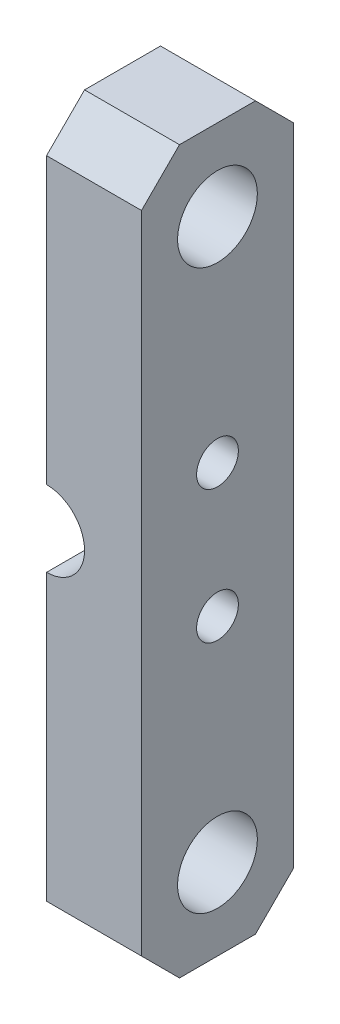
ISO-10303-21;
HEADER;
FILE_DESCRIPTION(('STEP AP214'),'2;1');
FILE_NAME('part.step','',(''),(''),'','','');
FILE_SCHEMA(('AUTOMOTIVE_DESIGN { 1 0 10303 214 1 1 1 1 }'));
ENDSEC;
DATA;
#1=APPLICATION_CONTEXT('core data for automotive mechanical design processes');
#2=APPLICATION_PROTOCOL_DEFINITION('international standard','automotive_design',2000,#1);
#3=PRODUCT_CONTEXT('',#1,'mechanical');
#4=PRODUCT('Part','Part','',(#3));
#5=PRODUCT_RELATED_PRODUCT_CATEGORY('part','',(#4));
#6=PRODUCT_DEFINITION_FORMATION('','',#4);
#7=PRODUCT_DEFINITION_CONTEXT('part definition',#1,'design');
#8=PRODUCT_DEFINITION('design','',#6,#7);
#9=PRODUCT_DEFINITION_SHAPE('','',#8);
#10=(LENGTH_UNIT() NAMED_UNIT(*) SI_UNIT(.MILLI.,.METRE.));
#11=(NAMED_UNIT(*) PLANE_ANGLE_UNIT() SI_UNIT($,.RADIAN.));
#12=(NAMED_UNIT(*) SI_UNIT($,.STERADIAN.) SOLID_ANGLE_UNIT());
#13=UNCERTAINTY_MEASURE_WITH_UNIT(LENGTH_MEASURE(1.E-05),#10,'distance_accuracy_value','');
#14=(GEOMETRIC_REPRESENTATION_CONTEXT(3) GLOBAL_UNCERTAINTY_ASSIGNED_CONTEXT((#13)) GLOBAL_UNIT_ASSIGNED_CONTEXT((#10,
#11,#12)) REPRESENTATION_CONTEXT('',''));
#15=CARTESIAN_POINT('',(0.,0.,0.));
#16=DIRECTION('',(0.,0.,1.));
#17=DIRECTION('',(1.,0.,0.));
#18=AXIS2_PLACEMENT_3D('',#15,#16,#17);
#19=CARTESIAN_POINT('',(0.,-37.9999999999996,-18.));
#20=DIRECTION('',(0.,0.,-1.));
#21=DIRECTION('',(0.,1.,0.));
#22=AXIS2_PLACEMENT_3D('',#19,#20,#21);
#23=PLANE('',#22);
#24=DIRECTION('',(0.,1.,0.));
#25=VECTOR('',#24,1.);
#26=CARTESIAN_POINT('',(10.,-37.9999999999996,-18.));
#27=LINE('',#26,#25);
#28=CARTESIAN_POINT('',(10.,-33.9999999999996,-18.));
#29=VERTEX_POINT('',#28);
#30=CARTESIAN_POINT('',(10.,33.9999999999996,-18.));
#31=VERTEX_POINT('',#30);
#32=EDGE_CURVE('E146',#29,#31,#27,.T.);
#33=ORIENTED_EDGE('',*,*,#32,.F.);
#34=DIRECTION('',(-1.,0.,0.));
#35=VECTOR('',#34,1.);
#36=CARTESIAN_POINT('',(0.,-33.9999999999996,-18.));
#37=LINE('',#36,#35);
#38=CARTESIAN_POINT('',(0.,-33.9999999999996,-18.));
#39=VERTEX_POINT('',#38);
#40=EDGE_CURVE('E174',#29,#39,#37,.T.);
#41=ORIENTED_EDGE('',*,*,#40,.T.);
#42=DIRECTION('',(0.,1.,0.));
#43=VECTOR('',#42,1.);
#44=CARTESIAN_POINT('',(0.,-37.9999999999996,-18.));
#45=LINE('',#44,#43);
#46=CARTESIAN_POINT('',(0.,-3.99999999999929,-18.));
#47=VERTEX_POINT('',#46);
#48=EDGE_CURVE('E126',#39,#47,#45,.T.);
#49=ORIENTED_EDGE('',*,*,#48,.T.);
#50=CARTESIAN_POINT('',(0.,7.23379689482329E-13,-18.));
#51=DIRECTION('',(0.,0.,1.));
#52=DIRECTION('',(1.,0.,0.));
#53=AXIS2_PLACEMENT_3D('',#50,#51,#52);
#54=CIRCLE('',#53,4.00000000000002);
#55=CARTESIAN_POINT('',(0.,4.00000000000074,-18.));
#56=VERTEX_POINT('',#55);
#57=EDGE_CURVE('E109',#47,#56,#54,.T.);
#58=ORIENTED_EDGE('',*,*,#57,.T.);
#59=CARTESIAN_POINT('',(0.,33.9999999999996,-18.));
#60=VERTEX_POINT('',#59);
#61=EDGE_CURVE('E123',#56,#60,#45,.T.);
#62=ORIENTED_EDGE('',*,*,#61,.T.);
#63=DIRECTION('',(1.,0.,0.));
#64=VECTOR('',#63,1.);
#65=CARTESIAN_POINT('',(0.,33.9999999999996,-18.));
#66=LINE('',#65,#64);
#67=EDGE_CURVE('E162',#60,#31,#66,.T.);
#68=ORIENTED_EDGE('',*,*,#67,.T.);
#69=EDGE_LOOP('',(#33,#41,#49,#58,#62,#68));
#70=FACE_BOUND('',#69,.T.);
#71=ADVANCED_FACE('F30',(#70),#23,.T.);
#72=CARTESIAN_POINT('',(0.,-37.9999999999996,-18.));
#73=DIRECTION('',(1.,0.,0.));
#74=DIRECTION('',(0.,0.,-1.));
#75=AXIS2_PLACEMENT_3D('',#72,#73,#74);
#76=PLANE('',#75);
#77=CARTESIAN_POINT('',(0.,7.,-10.));
#78=DIRECTION('',(1.,0.,0.));
#79=DIRECTION('',(0.,0.,-1.));
#80=AXIS2_PLACEMENT_3D('',#77,#78,#79);
#81=CIRCLE('',#80,2.20000000000001);
#82=CARTESIAN_POINT('',(0.,7.,-12.2));
#83=VERTEX_POINT('',#82);
#84=EDGE_CURVE('E368',#83,#83,#81,.T.);
#85=ORIENTED_EDGE('',*,*,#84,.T.);
#86=EDGE_LOOP('',(#85));
#87=FACE_BOUND('',#86,.T.);
#88=CARTESIAN_POINT('',(0.,29.4448637286706,-9.9999999999997));
#89=DIRECTION('',(1.,0.,0.));
#90=DIRECTION('',(0.,0.,-1.));
#91=AXIS2_PLACEMENT_3D('',#88,#89,#90);
#92=CIRCLE('',#91,4.20000000000001);
#93=CARTESIAN_POINT('',(0.,29.4448637286706,-14.1999999999997));
#94=VERTEX_POINT('',#93);
#95=EDGE_CURVE('E353',#94,#94,#92,.T.);
#96=ORIENTED_EDGE('',*,*,#95,.T.);
#97=EDGE_LOOP('',(#96));
#98=FACE_BOUND('',#97,.T.);
#99=DIRECTION('',(0.,0.,1.));
#100=VECTOR('',#99,1.);
#101=CARTESIAN_POINT('',(0.,37.9999999999996,-18.));
#102=LINE('',#101,#100);
#103=CARTESIAN_POINT('',(0.,37.9999999999996,-14.));
#104=VERTEX_POINT('',#103);
#105=CARTESIAN_POINT('',(0.,37.9999999999996,-6.));
#106=VERTEX_POINT('',#105);
#107=EDGE_CURVE('E135',#104,#106,#102,.T.);
#108=ORIENTED_EDGE('',*,*,#107,.F.);
#109=DIRECTION('',(0.,0.70710678118655,0.707106781186545));
#110=VECTOR('',#109,1.);
#111=CARTESIAN_POINT('',(0.,33.9999999999996,-18.));
#112=LINE('',#111,#110);
#113=EDGE_CURVE('E132',#104,#60,#112,.F.);
#114=ORIENTED_EDGE('',*,*,#113,.T.);
#115=ORIENTED_EDGE('',*,*,#61,.F.);
#116=DIRECTION('',(0.,0.,1.));
#117=VECTOR('',#116,1.);
#118=CARTESIAN_POINT('',(0.,4.00000000000074,-2.00000000000001));
#119=LINE('',#118,#117);
#120=CARTESIAN_POINT('',(0.,4.00000000000074,-2.00000000000001));
#121=VERTEX_POINT('',#120);
#122=EDGE_CURVE('E106',#56,#121,#119,.T.);
#123=ORIENTED_EDGE('',*,*,#122,.T.);
#124=DIRECTION('',(0.,-1.,0.));
#125=VECTOR('',#124,1.);
#126=CARTESIAN_POINT('',(0.,37.9999999999996,-2.00000000000001));
#127=LINE('',#126,#125);
#128=CARTESIAN_POINT('',(0.,33.9999999999996,-2.00000000000001));
#129=VERTEX_POINT('',#128);
#130=EDGE_CURVE('E142',#129,#121,#127,.T.);
#131=ORIENTED_EDGE('',*,*,#130,.F.);
#132=DIRECTION('',(0.,-0.70710678118655,0.707106781186545));
#133=VECTOR('',#132,1.);
#134=CARTESIAN_POINT('',(0.,37.9999999999996,-5.99999999999999));
#135=LINE('',#134,#133);
#136=EDGE_CURVE('E159',#129,#106,#135,.F.);
#137=ORIENTED_EDGE('',*,*,#136,.T.);
#138=EDGE_LOOP('',(#108,#114,#115,#123,#131,#137));
#139=FACE_BOUND('',#138,.T.);
#140=ADVANCED_FACE('F130',(#87,#98,#139),#76,.F.);
#141=CARTESIAN_POINT('',(0.,-37.9999999999996,-2.00000000000001));
#142=DIRECTION('',(0.,-1.,0.));
#143=DIRECTION('',(0.,0.,-1.));
#144=AXIS2_PLACEMENT_3D('',#141,#142,#143);
#145=PLANE('',#144);
#146=DIRECTION('',(0.,0.,-1.));
#147=VECTOR('',#146,1.);
#148=CARTESIAN_POINT('',(10.,-37.9999999999996,-2.00000000000001));
#149=LINE('',#148,#147);
#150=CARTESIAN_POINT('',(10.,-37.9999999999996,-6.00000000000004));
#151=VERTEX_POINT('',#150);
#152=CARTESIAN_POINT('',(10.,-37.9999999999996,-14.));
#153=VERTEX_POINT('',#152);
#154=EDGE_CURVE('E144',#151,#153,#149,.T.);
#155=ORIENTED_EDGE('',*,*,#154,.F.);
#156=DIRECTION('',(-1.,0.,0.));
#157=VECTOR('',#156,1.);
#158=CARTESIAN_POINT('',(0.,-37.9999999999996,-6.00000000000004));
#159=LINE('',#158,#157);
#160=CARTESIAN_POINT('',(0.,-37.9999999999996,-6.00000000000004));
#161=VERTEX_POINT('',#160);
#162=EDGE_CURVE('E38',#151,#161,#159,.T.);
#163=ORIENTED_EDGE('',*,*,#162,.T.);
#164=DIRECTION('',(0.,0.,-1.));
#165=VECTOR('',#164,1.);
#166=CARTESIAN_POINT('',(0.,-37.9999999999996,-2.00000000000001));
#167=LINE('',#166,#165);
#168=CARTESIAN_POINT('',(0.,-37.9999999999996,-14.));
#169=VERTEX_POINT('',#168);
#170=EDGE_CURVE('E133',#161,#169,#167,.T.);
#171=ORIENTED_EDGE('',*,*,#170,.T.);
#172=DIRECTION('',(1.,0.,0.));
#173=VECTOR('',#172,1.);
#174=CARTESIAN_POINT('',(0.,-37.9999999999996,-14.));
#175=LINE('',#174,#173);
#176=EDGE_CURVE('E169',#169,#153,#175,.T.);
#177=ORIENTED_EDGE('',*,*,#176,.T.);
#178=EDGE_LOOP('',(#155,#163,#171,#177));
#179=FACE_BOUND('',#178,.T.);
#180=ADVANCED_FACE('F216',(#179),#145,.T.);
#181=CARTESIAN_POINT('',(0.,37.9999999999996,-2.00000000000001));
#182=DIRECTION('',(0.,0.,1.));
#183=DIRECTION('',(1.,0.,0.));
#184=AXIS2_PLACEMENT_3D('',#181,#182,#183);
#185=PLANE('',#184);
#186=CARTESIAN_POINT('',(0.,-3.99999999999929,-2.00000000000001));
#187=VERTEX_POINT('',#186);
#188=CARTESIAN_POINT('',(0.,-33.9999999999996,-2.00000000000001));
#189=VERTEX_POINT('',#188);
#190=EDGE_CURVE('E141',#187,#189,#127,.T.);
#191=ORIENTED_EDGE('',*,*,#190,.T.);
#192=DIRECTION('',(1.,0.,0.));
#193=VECTOR('',#192,1.);
#194=CARTESIAN_POINT('',(0.,-33.9999999999996,-2.00000000000001));
#195=LINE('',#194,#193);
#196=CARTESIAN_POINT('',(10.,-33.9999999999996,-2.));
#197=VERTEX_POINT('',#196);
#198=EDGE_CURVE('E179',#189,#197,#195,.T.);
#199=ORIENTED_EDGE('',*,*,#198,.T.);
#200=DIRECTION('',(0.,-1.,0.));
#201=VECTOR('',#200,1.);
#202=CARTESIAN_POINT('',(10.,37.9999999999996,-2.00000000000001));
#203=LINE('',#202,#201);
#204=CARTESIAN_POINT('',(10.,33.9999999999996,-2.00000000000001));
#205=VERTEX_POINT('',#204);
#206=EDGE_CURVE('E136',#205,#197,#203,.T.);
#207=ORIENTED_EDGE('',*,*,#206,.F.);
#208=DIRECTION('',(-1.,0.,0.));
#209=VECTOR('',#208,1.);
#210=CARTESIAN_POINT('',(0.,33.9999999999996,-2.00000000000001));
#211=LINE('',#210,#209);
#212=EDGE_CURVE('E157',#205,#129,#211,.T.);
#213=ORIENTED_EDGE('',*,*,#212,.T.);
#214=ORIENTED_EDGE('',*,*,#130,.T.);
#215=CARTESIAN_POINT('',(0.,7.23379689482329E-13,-2.00000000000001));
#216=DIRECTION('',(0.,0.,1.));
#217=DIRECTION('',(1.,0.,0.));
#218=AXIS2_PLACEMENT_3D('',#215,#216,#217);
#219=CIRCLE('',#218,4.00000000000002);
#220=EDGE_CURVE('E112',#187,#121,#219,.T.);
#221=ORIENTED_EDGE('',*,*,#220,.F.);
#222=EDGE_LOOP('',(#191,#199,#207,#213,#214,#221));
#223=FACE_BOUND('',#222,.T.);
#224=ADVANCED_FACE('F186',(#223),#185,.T.);
#225=CARTESIAN_POINT('',(0.,37.9999999999996,-18.));
#226=DIRECTION('',(0.,1.,0.));
#227=DIRECTION('',(0.,0.,1.));
#228=AXIS2_PLACEMENT_3D('',#225,#226,#227);
#229=PLANE('',#228);
#230=DIRECTION('',(0.,0.,1.));
#231=VECTOR('',#230,1.);
#232=CARTESIAN_POINT('',(10.,37.9999999999996,-18.));
#233=LINE('',#232,#231);
#234=CARTESIAN_POINT('',(10.,37.9999999999996,-14.));
#235=VERTEX_POINT('',#234);
#236=CARTESIAN_POINT('',(10.,37.9999999999997,-6.00000000000001));
#237=VERTEX_POINT('',#236);
#238=EDGE_CURVE('E149',#235,#237,#233,.T.);
#239=ORIENTED_EDGE('',*,*,#238,.F.);
#240=DIRECTION('',(-1.,0.,0.));
#241=VECTOR('',#240,1.);
#242=CARTESIAN_POINT('',(0.,37.9999999999996,-14.));
#243=LINE('',#242,#241);
#244=EDGE_CURVE('E166',#235,#104,#243,.T.);
#245=ORIENTED_EDGE('',*,*,#244,.T.);
#246=ORIENTED_EDGE('',*,*,#107,.T.);
#247=DIRECTION('',(1.,0.,0.));
#248=VECTOR('',#247,1.);
#249=CARTESIAN_POINT('',(0.,37.9999999999996,-5.99999999999999));
#250=LINE('',#249,#248);
#251=EDGE_CURVE('E116',#106,#237,#250,.T.);
#252=ORIENTED_EDGE('',*,*,#251,.T.);
#253=EDGE_LOOP('',(#239,#245,#246,#252));
#254=FACE_BOUND('',#253,.T.);
#255=ADVANCED_FACE('F199',(#254),#229,.T.);
#256=CARTESIAN_POINT('',(0.,-29.4448637286711,-9.99999999999993));
#257=DIRECTION('',(1.,0.,0.));
#258=DIRECTION('',(0.,0.,-1.));
#259=AXIS2_PLACEMENT_3D('',#256,#257,#258);
#260=CIRCLE('',#259,4.20000000000001);
#261=CARTESIAN_POINT('',(0.,-29.4448637286711,-14.1999999999999));
#262=VERTEX_POINT('',#261);
#263=EDGE_CURVE('E362',#262,#262,#260,.T.);
#264=ORIENTED_EDGE('',*,*,#263,.T.);
#265=EDGE_LOOP('',(#264));
#266=FACE_BOUND('',#265,.T.);
#267=CARTESIAN_POINT('',(0.,-7.,-10.));
#268=DIRECTION('',(1.,0.,0.));
#269=DIRECTION('',(0.,0.,-1.));
#270=AXIS2_PLACEMENT_3D('',#267,#268,#269);
#271=CIRCLE('',#270,2.20000000000001);
#272=CARTESIAN_POINT('',(0.,-7.,-12.2));
#273=VERTEX_POINT('',#272);
#274=EDGE_CURVE('E147',#273,#273,#271,.T.);
#275=ORIENTED_EDGE('',*,*,#274,.T.);
#276=EDGE_LOOP('',(#275));
#277=FACE_BOUND('',#276,.T.);
#278=ORIENTED_EDGE('',*,*,#170,.F.);
#279=DIRECTION('',(0.,-0.707106781186545,-0.70710678118655));
#280=VECTOR('',#279,1.);
#281=CARTESIAN_POINT('',(0.,-33.9999999999996,-2.00000000000001));
#282=LINE('',#281,#280);
#283=EDGE_CURVE('E11',#161,#189,#282,.F.);
#284=ORIENTED_EDGE('',*,*,#283,.T.);
#285=ORIENTED_EDGE('',*,*,#190,.F.);
#286=DIRECTION('',(0.,0.,1.));
#287=VECTOR('',#286,1.);
#288=CARTESIAN_POINT('',(0.,-3.99999999999929,-2.00000000000001));
#289=LINE('',#288,#287);
#290=EDGE_CURVE('E117',#187,#47,#289,.F.);
#291=ORIENTED_EDGE('',*,*,#290,.T.);
#292=ORIENTED_EDGE('',*,*,#48,.F.);
#293=DIRECTION('',(0.,0.707106781186549,-0.707106781186546));
#294=VECTOR('',#293,1.);
#295=CARTESIAN_POINT('',(0.,-37.9999999999996,-14.));
#296=LINE('',#295,#294);
#297=EDGE_CURVE('E176',#39,#169,#296,.F.);
#298=ORIENTED_EDGE('',*,*,#297,.T.);
#299=EDGE_LOOP('',(#278,#284,#285,#291,#292,#298));
#300=FACE_BOUND('',#299,.T.);
#301=ADVANCED_FACE('F203',(#266,#277,#300),#76,.F.);
#302=CARTESIAN_POINT('',(10.,-37.9999999999996,-18.));
#303=DIRECTION('',(1.,0.,0.));
#304=DIRECTION('',(0.,0.,-1.));
#305=AXIS2_PLACEMENT_3D('',#302,#303,#304);
#306=PLANE('',#305);
#307=CARTESIAN_POINT('',(10.,29.4448637286706,-9.9999999999997));
#308=DIRECTION('',(1.,0.,0.));
#309=DIRECTION('',(0.,0.,-1.));
#310=AXIS2_PLACEMENT_3D('',#307,#308,#309);
#311=CIRCLE('',#310,4.20000000000001);
#312=CARTESIAN_POINT('',(10.,29.4448637286706,-14.1999999999997));
#313=VERTEX_POINT('',#312);
#314=EDGE_CURVE('E127',#313,#313,#311,.T.);
#315=ORIENTED_EDGE('',*,*,#314,.F.);
#316=EDGE_LOOP('',(#315));
#317=FACE_BOUND('',#316,.T.);
#318=CARTESIAN_POINT('',(10.,-29.4448637286711,-9.99999999999993));
#319=DIRECTION('',(1.,0.,0.));
#320=DIRECTION('',(0.,0.,-1.));
#321=AXIS2_PLACEMENT_3D('',#318,#319,#320);
#322=CIRCLE('',#321,4.20000000000001);
#323=CARTESIAN_POINT('',(10.,-29.4448637286711,-14.1999999999999));
#324=VERTEX_POINT('',#323);
#325=EDGE_CURVE('E357',#324,#324,#322,.T.);
#326=ORIENTED_EDGE('',*,*,#325,.F.);
#327=EDGE_LOOP('',(#326));
#328=FACE_BOUND('',#327,.T.);
#329=CARTESIAN_POINT('',(10.,7.,-10.));
#330=DIRECTION('',(1.,0.,0.));
#331=DIRECTION('',(0.,0.,-1.));
#332=AXIS2_PLACEMENT_3D('',#329,#330,#331);
#333=CIRCLE('',#332,2.20000000000001);
#334=CARTESIAN_POINT('',(10.,7.,-12.2));
#335=VERTEX_POINT('',#334);
#336=EDGE_CURVE('E365',#335,#335,#333,.T.);
#337=ORIENTED_EDGE('',*,*,#336,.F.);
#338=EDGE_LOOP('',(#337));
#339=FACE_BOUND('',#338,.T.);
#340=CARTESIAN_POINT('',(10.,-7.,-10.));
#341=DIRECTION('',(1.,0.,0.));
#342=DIRECTION('',(0.,0.,-1.));
#343=AXIS2_PLACEMENT_3D('',#340,#341,#342);
#344=CIRCLE('',#343,2.20000000000001);
#345=CARTESIAN_POINT('',(10.,-7.,-12.2));
#346=VERTEX_POINT('',#345);
#347=EDGE_CURVE('E371',#346,#346,#344,.T.);
#348=ORIENTED_EDGE('',*,*,#347,.F.);
#349=EDGE_LOOP('',(#348));
#350=FACE_BOUND('',#349,.T.);
#351=ORIENTED_EDGE('',*,*,#206,.T.);
#352=DIRECTION('',(0.,0.707106781186545,0.70710678118655));
#353=VECTOR('',#352,1.);
#354=CARTESIAN_POINT('',(10.,-43.9999999999996,-12.0000000000001));
#355=LINE('',#354,#353);
#356=EDGE_CURVE('E52',#197,#151,#355,.F.);
#357=ORIENTED_EDGE('',*,*,#356,.T.);
#358=ORIENTED_EDGE('',*,*,#154,.T.);
#359=DIRECTION('',(0.,-0.707106781186549,0.707106781186546));
#360=VECTOR('',#359,1.);
#361=CARTESIAN_POINT('',(10.,-35.9999999999996,-16.));
#362=LINE('',#361,#360);
#363=EDGE_CURVE('E172',#153,#29,#362,.F.);
#364=ORIENTED_EDGE('',*,*,#363,.T.);
#365=ORIENTED_EDGE('',*,*,#32,.T.);
#366=DIRECTION('',(0.,-0.70710678118655,-0.707106781186545));
#367=VECTOR('',#366,1.);
#368=CARTESIAN_POINT('',(10.,-2.00000000000026,-53.9999999999996));
#369=LINE('',#368,#367);
#370=EDGE_CURVE('E164',#31,#235,#369,.F.);
#371=ORIENTED_EDGE('',*,*,#370,.T.);
#372=ORIENTED_EDGE('',*,*,#238,.T.);
#373=DIRECTION('',(0.,0.70710678118655,-0.707106781186545));
#374=VECTOR('',#373,1.);
#375=CARTESIAN_POINT('',(10.,5.99999999999976,25.9999999999997));
#376=LINE('',#375,#374);
#377=EDGE_CURVE('E155',#237,#205,#376,.F.);
#378=ORIENTED_EDGE('',*,*,#377,.T.);
#379=EDGE_LOOP('',(#351,#357,#358,#364,#365,#371,#372,#378));
#380=FACE_BOUND('',#379,.T.);
#381=ADVANCED_FACE('F191',(#317,#328,#339,#350,#380),#306,.T.);
#382=CARTESIAN_POINT('',(10.,-7.,-10.));
#383=DIRECTION('',(1.,0.,0.));
#384=DIRECTION('',(0.,0.,-1.));
#385=AXIS2_PLACEMENT_3D('',#382,#383,#384);
#386=CYLINDRICAL_SURFACE('',#385,2.20000000000001);
#387=ORIENTED_EDGE('',*,*,#274,.F.);
#388=EDGE_LOOP('',(#387));
#389=FACE_BOUND('',#388,.T.);
#390=ORIENTED_EDGE('',*,*,#347,.T.);
#391=EDGE_LOOP('',(#390));
#392=FACE_BOUND('',#391,.T.);
#393=ADVANCED_FACE('F277',(#389,#392),#386,.F.);
#394=CARTESIAN_POINT('',(10.,7.,-10.));
#395=DIRECTION('',(1.,0.,0.));
#396=DIRECTION('',(0.,0.,-1.));
#397=AXIS2_PLACEMENT_3D('',#394,#395,#396);
#398=CYLINDRICAL_SURFACE('',#397,2.20000000000001);
#399=ORIENTED_EDGE('',*,*,#84,.F.);
#400=EDGE_LOOP('',(#399));
#401=FACE_BOUND('',#400,.T.);
#402=ORIENTED_EDGE('',*,*,#336,.T.);
#403=EDGE_LOOP('',(#402));
#404=FACE_BOUND('',#403,.T.);
#405=ADVANCED_FACE('F291',(#401,#404),#398,.F.);
#406=CARTESIAN_POINT('',(10.,-29.4448637286711,-9.99999999999993));
#407=DIRECTION('',(1.,0.,0.));
#408=DIRECTION('',(0.,0.,-1.));
#409=AXIS2_PLACEMENT_3D('',#406,#407,#408);
#410=CYLINDRICAL_SURFACE('',#409,4.20000000000001);
#411=ORIENTED_EDGE('',*,*,#263,.F.);
#412=EDGE_LOOP('',(#411));
#413=FACE_BOUND('',#412,.T.);
#414=ORIENTED_EDGE('',*,*,#325,.T.);
#415=EDGE_LOOP('',(#414));
#416=FACE_BOUND('',#415,.T.);
#417=ADVANCED_FACE('F298',(#413,#416),#410,.F.);
#418=CARTESIAN_POINT('',(10.,29.4448637286706,-9.9999999999997));
#419=DIRECTION('',(1.,0.,0.));
#420=DIRECTION('',(0.,0.,-1.));
#421=AXIS2_PLACEMENT_3D('',#418,#419,#420);
#422=CYLINDRICAL_SURFACE('',#421,4.20000000000001);
#423=ORIENTED_EDGE('',*,*,#95,.F.);
#424=EDGE_LOOP('',(#423));
#425=FACE_BOUND('',#424,.T.);
#426=ORIENTED_EDGE('',*,*,#314,.T.);
#427=EDGE_LOOP('',(#426));
#428=FACE_BOUND('',#427,.T.);
#429=ADVANCED_FACE('F306',(#425,#428),#422,.F.);
#430=CARTESIAN_POINT('',(0.,7.23379689482329E-13,-2.00000000000001));
#431=DIRECTION('',(0.,0.,1.));
#432=DIRECTION('',(1.,0.,0.));
#433=AXIS2_PLACEMENT_3D('',#430,#431,#432);
#434=CYLINDRICAL_SURFACE('',#433,4.00000000000002);
#435=ORIENTED_EDGE('',*,*,#57,.F.);
#436=ORIENTED_EDGE('',*,*,#290,.F.);
#437=ORIENTED_EDGE('',*,*,#220,.T.);
#438=ORIENTED_EDGE('',*,*,#122,.F.);
#439=EDGE_LOOP('',(#435,#436,#437,#438));
#440=FACE_BOUND('',#439,.T.);
#441=ADVANCED_FACE('F108',(#440),#434,.F.);
#442=CARTESIAN_POINT('',(0.,37.9999999999996,-5.99999999999999));
#443=DIRECTION('',(0.,-0.707106781186545,-0.70710678118655));
#444=DIRECTION('',(0.,0.70710678118655,-0.707106781186545));
#445=AXIS2_PLACEMENT_3D('',#442,#443,#444);
#446=PLANE('',#445);
#447=ORIENTED_EDGE('',*,*,#136,.F.);
#448=ORIENTED_EDGE('',*,*,#212,.F.);
#449=ORIENTED_EDGE('',*,*,#377,.F.);
#450=ORIENTED_EDGE('',*,*,#251,.F.);
#451=EDGE_LOOP('',(#447,#448,#449,#450));
#452=FACE_BOUND('',#451,.T.);
#453=ADVANCED_FACE('F197',(#452),#446,.F.);
#454=CARTESIAN_POINT('',(0.,33.9999999999996,-18.));
#455=DIRECTION('',(0.,-0.707106781186545,0.70710678118655));
#456=DIRECTION('',(0.,-0.70710678118655,-0.707106781186545));
#457=AXIS2_PLACEMENT_3D('',#454,#455,#456);
#458=PLANE('',#457);
#459=ORIENTED_EDGE('',*,*,#113,.F.);
#460=ORIENTED_EDGE('',*,*,#244,.F.);
#461=ORIENTED_EDGE('',*,*,#370,.F.);
#462=ORIENTED_EDGE('',*,*,#67,.F.);
#463=EDGE_LOOP('',(#459,#460,#461,#462));
#464=FACE_BOUND('',#463,.T.);
#465=ADVANCED_FACE('F209',(#464),#458,.F.);
#466=CARTESIAN_POINT('',(0.,-37.9999999999996,-14.));
#467=DIRECTION('',(0.,0.707106781186546,0.707106781186549));
#468=DIRECTION('',(0.,-0.707106781186549,0.707106781186546));
#469=AXIS2_PLACEMENT_3D('',#466,#467,#468);
#470=PLANE('',#469);
#471=ORIENTED_EDGE('',*,*,#297,.F.);
#472=ORIENTED_EDGE('',*,*,#40,.F.);
#473=ORIENTED_EDGE('',*,*,#363,.F.);
#474=ORIENTED_EDGE('',*,*,#176,.F.);
#475=EDGE_LOOP('',(#471,#472,#473,#474));
#476=FACE_BOUND('',#475,.T.);
#477=ADVANCED_FACE('F205',(#476),#470,.F.);
#478=CARTESIAN_POINT('',(0.,-33.9999999999996,-2.00000000000001));
#479=DIRECTION('',(0.,0.70710678118655,-0.707106781186545));
#480=DIRECTION('',(0.,0.707106781186545,0.70710678118655));
#481=AXIS2_PLACEMENT_3D('',#478,#479,#480);
#482=PLANE('',#481);
#483=ORIENTED_EDGE('',*,*,#283,.F.);
#484=ORIENTED_EDGE('',*,*,#162,.F.);
#485=ORIENTED_EDGE('',*,*,#356,.F.);
#486=ORIENTED_EDGE('',*,*,#198,.F.);
#487=EDGE_LOOP('',(#483,#484,#485,#486));
#488=FACE_BOUND('',#487,.T.);
#489=ADVANCED_FACE('F32',(#488),#482,.F.);
#490=CLOSED_SHELL('',(#71,#140,#180,#224,#255,#301,#381,#393,#405,#417,#429,#441,#453,#465,#477,#489));
#491=MANIFOLD_SOLID_BREP('B2',#490);
#492=ADVANCED_BREP_SHAPE_REPRESENTATION('',(#18,#491),#14);
#493=SHAPE_DEFINITION_REPRESENTATION(#9,#492);
ENDSEC;
END-ISO-10303-21;
